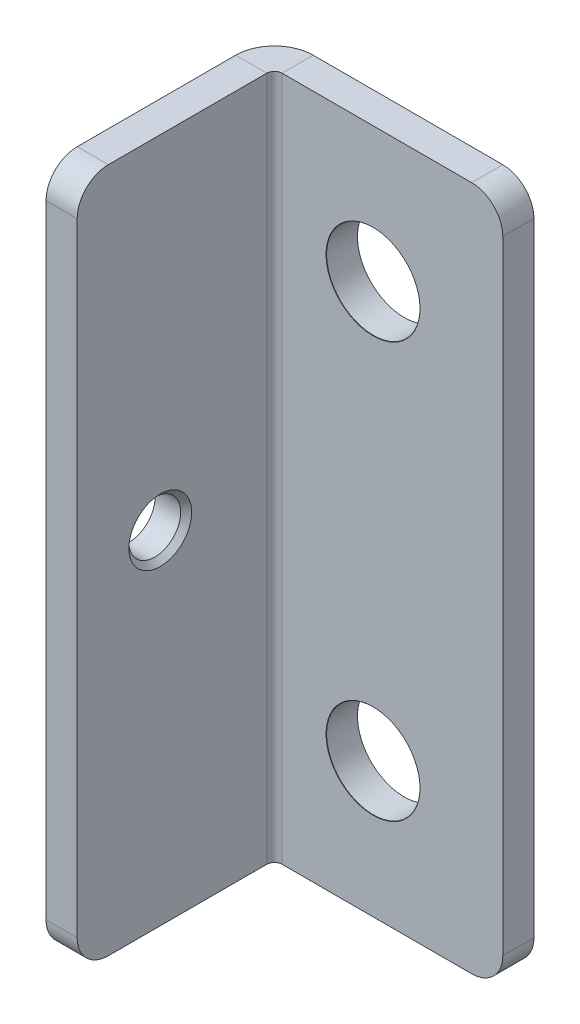
ISO-10303-21;
HEADER;
FILE_DESCRIPTION(('STEP AP214'),'2;1');
FILE_NAME('part.step','',(''),(''),'','','');
FILE_SCHEMA(('AUTOMOTIVE_DESIGN { 1 0 10303 214 1 1 1 1 }'));
ENDSEC;
DATA;
#1=APPLICATION_CONTEXT('core data for automotive mechanical design processes');
#2=APPLICATION_PROTOCOL_DEFINITION('international standard','automotive_design',2000,#1);
#3=PRODUCT_CONTEXT('',#1,'mechanical');
#4=PRODUCT('Part','Part','',(#3));
#5=PRODUCT_RELATED_PRODUCT_CATEGORY('part','',(#4));
#6=PRODUCT_DEFINITION_FORMATION('','',#4);
#7=PRODUCT_DEFINITION_CONTEXT('part definition',#1,'design');
#8=PRODUCT_DEFINITION('design','',#6,#7);
#9=PRODUCT_DEFINITION_SHAPE('','',#8);
#10=(LENGTH_UNIT() NAMED_UNIT(*) SI_UNIT(.MILLI.,.METRE.));
#11=(NAMED_UNIT(*) PLANE_ANGLE_UNIT() SI_UNIT($,.RADIAN.));
#12=(NAMED_UNIT(*) SI_UNIT($,.STERADIAN.) SOLID_ANGLE_UNIT());
#13=UNCERTAINTY_MEASURE_WITH_UNIT(LENGTH_MEASURE(1.E-05),#10,'distance_accuracy_value','');
#14=(GEOMETRIC_REPRESENTATION_CONTEXT(3) GLOBAL_UNCERTAINTY_ASSIGNED_CONTEXT((#13)) GLOBAL_UNIT_ASSIGNED_CONTEXT((#10,
#11,#12)) REPRESENTATION_CONTEXT('',''));
#15=CARTESIAN_POINT('',(0.,0.,0.));
#16=DIRECTION('',(0.,0.,1.));
#17=DIRECTION('',(1.,0.,0.));
#18=AXIS2_PLACEMENT_3D('',#15,#16,#17);
#19=CARTESIAN_POINT('',(-12.5,-33.,-3.));
#20=DIRECTION('',(0.,-1.,0.));
#21=DIRECTION('',(0.,0.,-1.));
#22=AXIS2_PLACEMENT_3D('',#19,#20,#21);
#23=PLANE('',#22);
#24=DIRECTION('',(1.,0.,0.));
#25=VECTOR('',#24,1.);
#26=CARTESIAN_POINT('',(-12.5,-33.,-3.));
#27=LINE('',#26,#25);
#28=CARTESIAN_POINT('',(-8.76339999999998,-33.,-3.));
#29=VERTEX_POINT('',#28);
#30=CARTESIAN_POINT('',(9.50000000000001,-33.,-3.));
#31=VERTEX_POINT('',#30);
#32=EDGE_CURVE('E258',#29,#31,#27,.T.);
#33=ORIENTED_EDGE('',*,*,#32,.T.);
#34=DIRECTION('',(0.,0.,1.));
#35=VECTOR('',#34,1.);
#36=CARTESIAN_POINT('',(9.50000000000001,-33.,-3.));
#37=LINE('',#36,#35);
#38=CARTESIAN_POINT('',(9.50000000000001,-33.,0.));
#39=VERTEX_POINT('',#38);
#40=EDGE_CURVE('E294',#31,#39,#37,.T.);
#41=ORIENTED_EDGE('',*,*,#40,.T.);
#42=DIRECTION('',(1.,0.,0.));
#43=VECTOR('',#42,1.);
#44=CARTESIAN_POINT('',(-12.5,-33.,0.));
#45=LINE('',#44,#43);
#46=CARTESIAN_POINT('',(-8.7634,-33.,0.));
#47=VERTEX_POINT('',#46);
#48=EDGE_CURVE('E251',#47,#39,#45,.T.);
#49=ORIENTED_EDGE('',*,*,#48,.F.);
#50=DIRECTION('',(0.,0.,-1.));
#51=VECTOR('',#50,1.);
#52=CARTESIAN_POINT('',(-8.7634,-33.,0.));
#53=LINE('',#52,#51);
#54=EDGE_CURVE('E227',#47,#29,#53,.T.);
#55=ORIENTED_EDGE('',*,*,#54,.T.);
#56=EDGE_LOOP('',(#33,#41,#49,#55));
#57=FACE_BOUND('',#56,.T.);
#58=ADVANCED_FACE('F68',(#57),#23,.T.);
#59=CARTESIAN_POINT('',(0.,0.,-3.));
#60=DIRECTION('',(0.,0.,1.));
#61=DIRECTION('',(1.,0.,0.));
#62=AXIS2_PLACEMENT_3D('',#59,#60,#61);
#63=PLANE('',#62);
#64=CARTESIAN_POINT('',(0.,20.,-3.));
#65=DIRECTION('',(0.,0.,1.));
#66=DIRECTION('',(1.,0.,0.));
#67=AXIS2_PLACEMENT_3D('',#64,#65,#66);
#68=CIRCLE('',#67,4.49999999999999);
#69=CARTESIAN_POINT('',(4.49999999999999,20.,-3.));
#70=VERTEX_POINT('',#69);
#71=EDGE_CURVE('E318',#70,#70,#68,.T.);
#72=ORIENTED_EDGE('',*,*,#71,.T.);
#73=EDGE_LOOP('',(#72));
#74=FACE_BOUND('',#73,.T.);
#75=CARTESIAN_POINT('',(0.,-20.,-3.));
#76=DIRECTION('',(0.,0.,1.));
#77=DIRECTION('',(1.,0.,0.));
#78=AXIS2_PLACEMENT_3D('',#75,#76,#77);
#79=CIRCLE('',#78,4.49999999999999);
#80=CARTESIAN_POINT('',(4.49999999999999,-20.,-3.));
#81=VERTEX_POINT('',#80);
#82=EDGE_CURVE('E223',#81,#81,#79,.T.);
#83=ORIENTED_EDGE('',*,*,#82,.T.);
#84=EDGE_LOOP('',(#83));
#85=FACE_BOUND('',#84,.T.);
#86=DIRECTION('',(0.,1.,0.));
#87=VECTOR('',#86,1.);
#88=CARTESIAN_POINT('',(12.5,33.,-3.));
#89=LINE('',#88,#87);
#90=CARTESIAN_POINT('',(12.5,-30.,-3.));
#91=VERTEX_POINT('',#90);
#92=CARTESIAN_POINT('',(12.5,30.,-3.));
#93=VERTEX_POINT('',#92);
#94=EDGE_CURVE('E249',#91,#93,#89,.T.);
#95=ORIENTED_EDGE('',*,*,#94,.F.);
#96=CARTESIAN_POINT('',(9.50000000000001,-30.,-3.));
#97=DIRECTION('',(0.,0.,1.));
#98=DIRECTION('',(1.,0.,0.));
#99=AXIS2_PLACEMENT_3D('',#96,#97,#98);
#100=CIRCLE('',#99,3.);
#101=EDGE_CURVE('E78',#91,#31,#100,.F.);
#102=ORIENTED_EDGE('',*,*,#101,.T.);
#103=ORIENTED_EDGE('',*,*,#32,.F.);
#104=DIRECTION('',(0.,-1.,0.));
#105=VECTOR('',#104,1.);
#106=CARTESIAN_POINT('',(-8.76339999999998,-33.,-3.));
#107=LINE('',#106,#105);
#108=CARTESIAN_POINT('',(-8.7634,33.,-3.));
#109=VERTEX_POINT('',#108);
#110=EDGE_CURVE('E168',#29,#109,#107,.F.);
#111=ORIENTED_EDGE('',*,*,#110,.T.);
#112=DIRECTION('',(-1.,0.,0.));
#113=VECTOR('',#112,1.);
#114=CARTESIAN_POINT('',(-12.5,33.,-3.));
#115=LINE('',#114,#113);
#116=CARTESIAN_POINT('',(9.5,33.,-3.));
#117=VERTEX_POINT('',#116);
#118=EDGE_CURVE('E252',#117,#109,#115,.T.);
#119=ORIENTED_EDGE('',*,*,#118,.F.);
#120=CARTESIAN_POINT('',(9.5,30.,-3.));
#121=DIRECTION('',(0.,0.,1.));
#122=DIRECTION('',(1.,0.,0.));
#123=AXIS2_PLACEMENT_3D('',#120,#121,#122);
#124=CIRCLE('',#123,3.);
#125=EDGE_CURVE('E95',#117,#93,#124,.F.);
#126=ORIENTED_EDGE('',*,*,#125,.T.);
#127=EDGE_LOOP('',(#95,#102,#103,#111,#119,#126));
#128=FACE_BOUND('',#127,.T.);
#129=ADVANCED_FACE('F356',(#74,#85,#128),#63,.F.);
#130=CARTESIAN_POINT('',(0.,0.,0.));
#131=DIRECTION('',(0.,0.,1.));
#132=DIRECTION('',(1.,0.,0.));
#133=AXIS2_PLACEMENT_3D('',#130,#131,#132);
#134=PLANE('',#133);
#135=CARTESIAN_POINT('',(0.,20.,0.));
#136=DIRECTION('',(0.,0.,1.));
#137=DIRECTION('',(1.,0.,0.));
#138=AXIS2_PLACEMENT_3D('',#135,#136,#137);
#139=CIRCLE('',#138,4.525);
#140=CARTESIAN_POINT('',(4.525,20.,0.));
#141=VERTEX_POINT('',#140);
#142=EDGE_CURVE('E329',#141,#141,#139,.T.);
#143=ORIENTED_EDGE('',*,*,#142,.F.);
#144=EDGE_LOOP('',(#143));
#145=FACE_BOUND('',#144,.T.);
#146=CARTESIAN_POINT('',(0.,-20.,0.));
#147=DIRECTION('',(0.,0.,1.));
#148=DIRECTION('',(1.,0.,0.));
#149=AXIS2_PLACEMENT_3D('',#146,#147,#148);
#150=CIRCLE('',#149,4.525);
#151=CARTESIAN_POINT('',(4.525,-20.,0.));
#152=VERTEX_POINT('',#151);
#153=EDGE_CURVE('E321',#152,#152,#150,.T.);
#154=ORIENTED_EDGE('',*,*,#153,.F.);
#155=EDGE_LOOP('',(#154));
#156=FACE_BOUND('',#155,.T.);
#157=ORIENTED_EDGE('',*,*,#48,.T.);
#158=CARTESIAN_POINT('',(9.50000000000001,-30.,0.));
#159=DIRECTION('',(0.,0.,1.));
#160=DIRECTION('',(1.,0.,0.));
#161=AXIS2_PLACEMENT_3D('',#158,#159,#160);
#162=CIRCLE('',#161,3.);
#163=CARTESIAN_POINT('',(12.5,-30.,0.));
#164=VERTEX_POINT('',#163);
#165=EDGE_CURVE('E303',#39,#164,#162,.T.);
#166=ORIENTED_EDGE('',*,*,#165,.T.);
#167=DIRECTION('',(0.,1.,0.));
#168=VECTOR('',#167,1.);
#169=CARTESIAN_POINT('',(12.5,33.,0.));
#170=LINE('',#169,#168);
#171=CARTESIAN_POINT('',(12.5,30.,0.));
#172=VERTEX_POINT('',#171);
#173=EDGE_CURVE('E245',#164,#172,#170,.T.);
#174=ORIENTED_EDGE('',*,*,#173,.T.);
#175=CARTESIAN_POINT('',(9.5,30.,0.));
#176=DIRECTION('',(0.,0.,1.));
#177=DIRECTION('',(1.,0.,0.));
#178=AXIS2_PLACEMENT_3D('',#175,#176,#177);
#179=CIRCLE('',#178,3.);
#180=CARTESIAN_POINT('',(9.5,33.,0.));
#181=VERTEX_POINT('',#180);
#182=EDGE_CURVE('E299',#172,#181,#179,.T.);
#183=ORIENTED_EDGE('',*,*,#182,.T.);
#184=DIRECTION('',(-1.,0.,0.));
#185=VECTOR('',#184,1.);
#186=CARTESIAN_POINT('',(-12.5,33.,0.));
#187=LINE('',#186,#185);
#188=CARTESIAN_POINT('',(-8.7634,33.,0.));
#189=VERTEX_POINT('',#188);
#190=EDGE_CURVE('E262',#181,#189,#187,.T.);
#191=ORIENTED_EDGE('',*,*,#190,.T.);
#192=DIRECTION('',(0.,-1.,0.));
#193=VECTOR('',#192,1.);
#194=CARTESIAN_POINT('',(-8.7634,-33.,0.));
#195=LINE('',#194,#193);
#196=EDGE_CURVE('E235',#47,#189,#195,.F.);
#197=ORIENTED_EDGE('',*,*,#196,.F.);
#198=EDGE_LOOP('',(#157,#166,#174,#183,#191,#197));
#199=FACE_BOUND('',#198,.T.);
#200=ADVANCED_FACE('F353',(#145,#156,#199),#134,.T.);
#201=CARTESIAN_POINT('',(12.5,33.,-3.));
#202=DIRECTION('',(1.,0.,0.));
#203=DIRECTION('',(0.,1.,0.));
#204=AXIS2_PLACEMENT_3D('',#201,#202,#203);
#205=PLANE('',#204);
#206=ORIENTED_EDGE('',*,*,#173,.F.);
#207=DIRECTION('',(0.,0.,1.));
#208=VECTOR('',#207,1.);
#209=CARTESIAN_POINT('',(12.5,-30.,-3.));
#210=LINE('',#209,#208);
#211=EDGE_CURVE('E306',#164,#91,#210,.F.);
#212=ORIENTED_EDGE('',*,*,#211,.T.);
#213=ORIENTED_EDGE('',*,*,#94,.T.);
#214=DIRECTION('',(0.,0.,1.));
#215=VECTOR('',#214,1.);
#216=CARTESIAN_POINT('',(12.5,30.,-3.));
#217=LINE('',#216,#215);
#218=EDGE_CURVE('E304',#93,#172,#217,.T.);
#219=ORIENTED_EDGE('',*,*,#218,.T.);
#220=EDGE_LOOP('',(#206,#212,#213,#219));
#221=FACE_BOUND('',#220,.T.);
#222=ADVANCED_FACE('F360',(#221),#205,.T.);
#223=CARTESIAN_POINT('',(-12.5,33.,-3.));
#224=DIRECTION('',(0.,1.,0.));
#225=DIRECTION('',(0.,0.,1.));
#226=AXIS2_PLACEMENT_3D('',#223,#224,#225);
#227=PLANE('',#226);
#228=ORIENTED_EDGE('',*,*,#190,.F.);
#229=DIRECTION('',(0.,0.,1.));
#230=VECTOR('',#229,1.);
#231=CARTESIAN_POINT('',(9.5,33.,-3.));
#232=LINE('',#231,#230);
#233=EDGE_CURVE('E13',#181,#117,#232,.F.);
#234=ORIENTED_EDGE('',*,*,#233,.T.);
#235=ORIENTED_EDGE('',*,*,#118,.T.);
#236=DIRECTION('',(0.,0.,-1.));
#237=VECTOR('',#236,1.);
#238=CARTESIAN_POINT('',(-8.7634,33.,0.));
#239=LINE('',#238,#237);
#240=EDGE_CURVE('E241',#189,#109,#239,.T.);
#241=ORIENTED_EDGE('',*,*,#240,.F.);
#242=EDGE_LOOP('',(#228,#234,#235,#241));
#243=FACE_BOUND('',#242,.T.);
#244=ADVANCED_FACE('F388',(#243),#227,.T.);
#245=CARTESIAN_POINT('',(-8.7634,33.,0.7366));
#246=DIRECTION('',(0.,1.,0.));
#247=DIRECTION('',(0.,0.,1.));
#248=AXIS2_PLACEMENT_3D('',#245,#246,#247);
#249=PLANE('',#248);
#250=DIRECTION('',(1.,0.,0.));
#251=VECTOR('',#250,1.);
#252=CARTESIAN_POINT('',(-12.5,33.,0.736599999999986));
#253=LINE('',#252,#251);
#254=CARTESIAN_POINT('',(-9.50000000000001,33.,0.736599999999998));
#255=VERTEX_POINT('',#254);
#256=CARTESIAN_POINT('',(-12.5,33.,0.736599999999987));
#257=VERTEX_POINT('',#256);
#258=EDGE_CURVE('E222',#255,#257,#253,.F.);
#259=ORIENTED_EDGE('',*,*,#258,.F.);
#260=CARTESIAN_POINT('',(-8.7634,33.,0.7366));
#261=DIRECTION('',(0.,-1.,0.));
#262=DIRECTION('',(0.,0.,-1.));
#263=AXIS2_PLACEMENT_3D('',#260,#261,#262);
#264=CIRCLE('',#263,0.736600000000004);
#265=EDGE_CURVE('E174',#189,#255,#264,.F.);
#266=ORIENTED_EDGE('',*,*,#265,.F.);
#267=ORIENTED_EDGE('',*,*,#240,.T.);
#268=CARTESIAN_POINT('',(-8.7634,33.,0.7366));
#269=DIRECTION('',(0.,-1.,0.));
#270=DIRECTION('',(0.,0.,-1.));
#271=AXIS2_PLACEMENT_3D('',#268,#269,#270);
#272=CIRCLE('',#271,3.7366);
#273=EDGE_CURVE('E226',#109,#257,#272,.F.);
#274=ORIENTED_EDGE('',*,*,#273,.T.);
#275=EDGE_LOOP('',(#259,#266,#267,#274));
#276=FACE_BOUND('',#275,.T.);
#277=ADVANCED_FACE('F389',(#276),#249,.T.);
#278=CARTESIAN_POINT('',(-8.7634,-33.,0.7366));
#279=DIRECTION('',(0.,1.,0.));
#280=DIRECTION('',(0.,0.,1.));
#281=AXIS2_PLACEMENT_3D('',#278,#279,#280);
#282=PLANE('',#281);
#283=CARTESIAN_POINT('',(-8.7634,-33.,0.7366));
#284=DIRECTION('',(0.,-1.,0.));
#285=DIRECTION('',(0.,0.,-1.));
#286=AXIS2_PLACEMENT_3D('',#283,#284,#285);
#287=CIRCLE('',#286,0.736600000000004);
#288=CARTESIAN_POINT('',(-9.50000000000001,-33.,0.736599999999998));
#289=VERTEX_POINT('',#288);
#290=EDGE_CURVE('E182',#289,#47,#287,.T.);
#291=ORIENTED_EDGE('',*,*,#290,.F.);
#292=DIRECTION('',(1.,0.,0.));
#293=VECTOR('',#292,1.);
#294=CARTESIAN_POINT('',(-9.49999999999999,-33.,0.736599999999999));
#295=LINE('',#294,#293);
#296=CARTESIAN_POINT('',(-12.5,-33.,0.736599999999988));
#297=VERTEX_POINT('',#296);
#298=EDGE_CURVE('E179',#289,#297,#295,.F.);
#299=ORIENTED_EDGE('',*,*,#298,.T.);
#300=CARTESIAN_POINT('',(-8.7634,-33.,0.7366));
#301=DIRECTION('',(0.,-1.,0.));
#302=DIRECTION('',(0.,0.,-1.));
#303=AXIS2_PLACEMENT_3D('',#300,#301,#302);
#304=CIRCLE('',#303,3.7366);
#305=EDGE_CURVE('E165',#297,#29,#304,.T.);
#306=ORIENTED_EDGE('',*,*,#305,.T.);
#307=ORIENTED_EDGE('',*,*,#54,.F.);
#308=EDGE_LOOP('',(#291,#299,#306,#307));
#309=FACE_BOUND('',#308,.T.);
#310=ADVANCED_FACE('F178',(#309),#282,.F.);
#311=CARTESIAN_POINT('',(-8.7634,-33.,0.7366));
#312=DIRECTION('',(0.,-1.,0.));
#313=DIRECTION('',(-1.,0.,0.));
#314=AXIS2_PLACEMENT_3D('',#311,#312,#313);
#315=CYLINDRICAL_SURFACE('',#314,3.7366);
#316=ORIENTED_EDGE('',*,*,#110,.F.);
#317=ORIENTED_EDGE('',*,*,#305,.F.);
#318=DIRECTION('',(0.,-1.,0.));
#319=VECTOR('',#318,1.);
#320=CARTESIAN_POINT('',(-12.5,33.,0.736599999999986));
#321=LINE('',#320,#319);
#322=EDGE_CURVE('E170',#297,#257,#321,.F.);
#323=ORIENTED_EDGE('',*,*,#322,.T.);
#324=ORIENTED_EDGE('',*,*,#273,.F.);
#325=EDGE_LOOP('',(#316,#317,#323,#324));
#326=FACE_BOUND('',#325,.T.);
#327=ADVANCED_FACE('F163',(#326),#315,.T.);
#328=CARTESIAN_POINT('',(-8.7634,-33.,0.7366));
#329=DIRECTION('',(0.,-1.,0.));
#330=DIRECTION('',(-1.,0.,0.));
#331=AXIS2_PLACEMENT_3D('',#328,#329,#330);
#332=CYLINDRICAL_SURFACE('',#331,0.736600000000004);
#333=ORIENTED_EDGE('',*,*,#196,.T.);
#334=ORIENTED_EDGE('',*,*,#265,.T.);
#335=DIRECTION('',(0.,-1.,0.));
#336=VECTOR('',#335,1.);
#337=CARTESIAN_POINT('',(-9.5,33.,0.736599999999997));
#338=LINE('',#337,#336);
#339=EDGE_CURVE('E187',#255,#289,#338,.T.);
#340=ORIENTED_EDGE('',*,*,#339,.T.);
#341=ORIENTED_EDGE('',*,*,#290,.T.);
#342=EDGE_LOOP('',(#333,#334,#340,#341));
#343=FACE_BOUND('',#342,.T.);
#344=ADVANCED_FACE('F368',(#343),#332,.F.);
#345=CARTESIAN_POINT('',(-12.5000000000001,-33.,19.));
#346=DIRECTION('',(0.,1.,0.));
#347=DIRECTION('',(-1.,0.,0.));
#348=AXIS2_PLACEMENT_3D('',#345,#346,#347);
#349=PLANE('',#348);
#350=DIRECTION('',(0.,0.,-1.));
#351=VECTOR('',#350,1.);
#352=CARTESIAN_POINT('',(-9.50000000000006,-33.,19.));
#353=LINE('',#352,#351);
#354=CARTESIAN_POINT('',(-9.50000000000005,-33.,16.));
#355=VERTEX_POINT('',#354);
#356=EDGE_CURVE('E196',#289,#355,#353,.F.);
#357=ORIENTED_EDGE('',*,*,#356,.T.);
#358=DIRECTION('',(1.,0.,0.));
#359=VECTOR('',#358,1.);
#360=CARTESIAN_POINT('',(-12.5,-33.,16.));
#361=LINE('',#360,#359);
#362=CARTESIAN_POINT('',(-12.5,-33.,16.));
#363=VERTEX_POINT('',#362);
#364=EDGE_CURVE('E205',#355,#363,#361,.F.);
#365=ORIENTED_EDGE('',*,*,#364,.T.);
#366=DIRECTION('',(0.,0.,1.));
#367=VECTOR('',#366,1.);
#368=CARTESIAN_POINT('',(-12.5,-33.,0.));
#369=LINE('',#368,#367);
#370=EDGE_CURVE('E191',#297,#363,#369,.T.);
#371=ORIENTED_EDGE('',*,*,#370,.F.);
#372=ORIENTED_EDGE('',*,*,#298,.F.);
#373=EDGE_LOOP('',(#357,#365,#371,#372));
#374=FACE_BOUND('',#373,.T.);
#375=ADVANCED_FACE('F199',(#374),#349,.F.);
#376=CARTESIAN_POINT('',(-12.5,33.,0.));
#377=DIRECTION('',(0.,-1.,0.));
#378=DIRECTION('',(1.,0.,0.));
#379=AXIS2_PLACEMENT_3D('',#376,#377,#378);
#380=PLANE('',#379);
#381=DIRECTION('',(0.,0.,-1.));
#382=VECTOR('',#381,1.);
#383=CARTESIAN_POINT('',(-12.5,33.,0.));
#384=LINE('',#383,#382);
#385=CARTESIAN_POINT('',(-12.5000000000001,33.,16.));
#386=VERTEX_POINT('',#385);
#387=EDGE_CURVE('E198',#386,#257,#384,.T.);
#388=ORIENTED_EDGE('',*,*,#387,.F.);
#389=DIRECTION('',(1.,0.,0.));
#390=VECTOR('',#389,1.);
#391=CARTESIAN_POINT('',(-12.5000000000001,33.,16.));
#392=LINE('',#391,#390);
#393=CARTESIAN_POINT('',(-9.50000000000006,33.,16.));
#394=VERTEX_POINT('',#393);
#395=EDGE_CURVE('E257',#386,#394,#392,.T.);
#396=ORIENTED_EDGE('',*,*,#395,.T.);
#397=DIRECTION('',(0.,0.,1.));
#398=VECTOR('',#397,1.);
#399=CARTESIAN_POINT('',(-9.5,33.,0.));
#400=LINE('',#399,#398);
#401=EDGE_CURVE('E202',#394,#255,#400,.F.);
#402=ORIENTED_EDGE('',*,*,#401,.T.);
#403=ORIENTED_EDGE('',*,*,#258,.T.);
#404=EDGE_LOOP('',(#388,#396,#402,#403));
#405=FACE_BOUND('',#404,.T.);
#406=ADVANCED_FACE('F384',(#405),#380,.F.);
#407=CARTESIAN_POINT('',(-12.5,0.,0.));
#408=DIRECTION('',(1.,0.,0.));
#409=DIRECTION('',(0.,0.,-1.));
#410=AXIS2_PLACEMENT_3D('',#407,#408,#409);
#411=PLANE('',#410);
#412=CARTESIAN_POINT('',(-12.5,0.,11.));
#413=DIRECTION('',(1.,0.,0.));
#414=DIRECTION('',(0.,0.,-1.));
#415=AXIS2_PLACEMENT_3D('',#412,#413,#414);
#416=CIRCLE('',#415,2.5);
#417=CARTESIAN_POINT('',(-12.5,0.,8.5));
#418=VERTEX_POINT('',#417);
#419=EDGE_CURVE('E71',#418,#418,#416,.T.);
#420=ORIENTED_EDGE('',*,*,#419,.T.);
#421=EDGE_LOOP('',(#420));
#422=FACE_BOUND('',#421,.T.);
#423=DIRECTION('',(0.,1.,0.));
#424=VECTOR('',#423,1.);
#425=CARTESIAN_POINT('',(-12.5000000000001,0.,19.));
#426=LINE('',#425,#424);
#427=CARTESIAN_POINT('',(-12.5000000000001,-30.,19.));
#428=VERTEX_POINT('',#427);
#429=CARTESIAN_POINT('',(-12.5000000000001,30.,19.));
#430=VERTEX_POINT('',#429);
#431=EDGE_CURVE('E204',#428,#430,#426,.T.);
#432=ORIENTED_EDGE('',*,*,#431,.T.);
#433=CARTESIAN_POINT('',(-12.5000000000001,30.,16.));
#434=DIRECTION('',(1.,0.,0.));
#435=DIRECTION('',(0.,0.,-1.));
#436=AXIS2_PLACEMENT_3D('',#433,#434,#435);
#437=CIRCLE('',#436,3.);
#438=EDGE_CURVE('E288',#430,#386,#437,.F.);
#439=ORIENTED_EDGE('',*,*,#438,.T.);
#440=ORIENTED_EDGE('',*,*,#387,.T.);
#441=ORIENTED_EDGE('',*,*,#322,.F.);
#442=ORIENTED_EDGE('',*,*,#370,.T.);
#443=CARTESIAN_POINT('',(-12.5,-30.,16.));
#444=DIRECTION('',(1.,0.,0.));
#445=DIRECTION('',(0.,0.,-1.));
#446=AXIS2_PLACEMENT_3D('',#443,#444,#445);
#447=CIRCLE('',#446,3.);
#448=EDGE_CURVE('E286',#363,#428,#447,.F.);
#449=ORIENTED_EDGE('',*,*,#448,.T.);
#450=EDGE_LOOP('',(#432,#439,#440,#441,#442,#449));
#451=FACE_BOUND('',#450,.T.);
#452=ADVANCED_FACE('F195',(#422,#451),#411,.F.);
#453=CARTESIAN_POINT('',(-9.5,0.,0.));
#454=DIRECTION('',(1.,0.,0.));
#455=DIRECTION('',(0.,0.,-1.));
#456=AXIS2_PLACEMENT_3D('',#453,#454,#455);
#457=PLANE('',#456);
#458=CARTESIAN_POINT('',(-9.50000000000004,0.,11.));
#459=DIRECTION('',(1.,0.,0.));
#460=DIRECTION('',(0.,0.,-1.));
#461=AXIS2_PLACEMENT_3D('',#458,#459,#460);
#462=CIRCLE('',#461,3.025);
#463=CARTESIAN_POINT('',(-9.50000000000003,0.,7.97500000000001));
#464=VERTEX_POINT('',#463);
#465=EDGE_CURVE('E631',#464,#464,#462,.T.);
#466=ORIENTED_EDGE('',*,*,#465,.F.);
#467=EDGE_LOOP('',(#466));
#468=FACE_BOUND('',#467,.T.);
#469=ORIENTED_EDGE('',*,*,#401,.F.);
#470=CARTESIAN_POINT('',(-9.50000000000006,30.,16.));
#471=DIRECTION('',(1.,0.,0.));
#472=DIRECTION('',(0.,0.,-1.));
#473=AXIS2_PLACEMENT_3D('',#470,#471,#472);
#474=CIRCLE('',#473,3.);
#475=CARTESIAN_POINT('',(-9.50000000000007,30.,19.));
#476=VERTEX_POINT('',#475);
#477=EDGE_CURVE('E277',#394,#476,#474,.T.);
#478=ORIENTED_EDGE('',*,*,#477,.T.);
#479=DIRECTION('',(0.,-1.,0.));
#480=VECTOR('',#479,1.);
#481=CARTESIAN_POINT('',(-9.50000000000007,33.,19.));
#482=LINE('',#481,#480);
#483=CARTESIAN_POINT('',(-9.50000000000006,-30.,19.));
#484=VERTEX_POINT('',#483);
#485=EDGE_CURVE('E209',#484,#476,#482,.F.);
#486=ORIENTED_EDGE('',*,*,#485,.F.);
#487=CARTESIAN_POINT('',(-9.50000000000005,-30.,16.));
#488=DIRECTION('',(1.,0.,0.));
#489=DIRECTION('',(0.,0.,-1.));
#490=AXIS2_PLACEMENT_3D('',#487,#488,#489);
#491=CIRCLE('',#490,3.);
#492=EDGE_CURVE('E272',#484,#355,#491,.T.);
#493=ORIENTED_EDGE('',*,*,#492,.T.);
#494=ORIENTED_EDGE('',*,*,#356,.F.);
#495=ORIENTED_EDGE('',*,*,#339,.F.);
#496=EDGE_LOOP('',(#469,#478,#486,#493,#494,#495));
#497=FACE_BOUND('',#496,.T.);
#498=ADVANCED_FACE('F371',(#468,#497),#457,.T.);
#499=CARTESIAN_POINT('',(-12.5000000000001,33.,19.));
#500=DIRECTION('',(0.,0.,-1.));
#501=DIRECTION('',(-1.,0.,0.));
#502=AXIS2_PLACEMENT_3D('',#499,#500,#501);
#503=PLANE('',#502);
#504=ORIENTED_EDGE('',*,*,#485,.T.);
#505=DIRECTION('',(1.,0.,0.));
#506=VECTOR('',#505,1.);
#507=CARTESIAN_POINT('',(-12.5000000000001,30.,19.));
#508=LINE('',#507,#506);
#509=EDGE_CURVE('E281',#476,#430,#508,.F.);
#510=ORIENTED_EDGE('',*,*,#509,.T.);
#511=ORIENTED_EDGE('',*,*,#431,.F.);
#512=DIRECTION('',(1.,0.,0.));
#513=VECTOR('',#512,1.);
#514=CARTESIAN_POINT('',(-12.5000000000001,-30.,19.));
#515=LINE('',#514,#513);
#516=EDGE_CURVE('E276',#428,#484,#515,.T.);
#517=ORIENTED_EDGE('',*,*,#516,.T.);
#518=EDGE_LOOP('',(#504,#510,#511,#517));
#519=FACE_BOUND('',#518,.T.);
#520=ADVANCED_FACE('F377',(#519),#503,.F.);
#521=CARTESIAN_POINT('',(-12.5000000000001,30.,16.));
#522=DIRECTION('',(1.,0.,0.));
#523=DIRECTION('',(0.,0.,-1.));
#524=AXIS2_PLACEMENT_3D('',#521,#522,#523);
#525=CYLINDRICAL_SURFACE('',#524,3.);
#526=ORIENTED_EDGE('',*,*,#438,.F.);
#527=ORIENTED_EDGE('',*,*,#509,.F.);
#528=ORIENTED_EDGE('',*,*,#477,.F.);
#529=ORIENTED_EDGE('',*,*,#395,.F.);
#530=EDGE_LOOP('',(#526,#527,#528,#529));
#531=FACE_BOUND('',#530,.T.);
#532=ADVANCED_FACE('F385',(#531),#525,.T.);
#533=CARTESIAN_POINT('',(-12.5000000000001,-30.,16.));
#534=DIRECTION('',(1.,0.,0.));
#535=DIRECTION('',(0.,0.,-1.));
#536=AXIS2_PLACEMENT_3D('',#533,#534,#535);
#537=CYLINDRICAL_SURFACE('',#536,3.);
#538=ORIENTED_EDGE('',*,*,#448,.F.);
#539=ORIENTED_EDGE('',*,*,#364,.F.);
#540=ORIENTED_EDGE('',*,*,#492,.F.);
#541=ORIENTED_EDGE('',*,*,#516,.F.);
#542=EDGE_LOOP('',(#538,#539,#540,#541));
#543=FACE_BOUND('',#542,.T.);
#544=ADVANCED_FACE('F372',(#543),#537,.T.);
#545=CARTESIAN_POINT('',(9.50000000000001,-30.,-3.));
#546=DIRECTION('',(0.,0.,1.));
#547=DIRECTION('',(1.,0.,0.));
#548=AXIS2_PLACEMENT_3D('',#545,#546,#547);
#549=CYLINDRICAL_SURFACE('',#548,3.);
#550=ORIENTED_EDGE('',*,*,#101,.F.);
#551=ORIENTED_EDGE('',*,*,#211,.F.);
#552=ORIENTED_EDGE('',*,*,#165,.F.);
#553=ORIENTED_EDGE('',*,*,#40,.F.);
#554=EDGE_LOOP('',(#550,#551,#552,#553));
#555=FACE_BOUND('',#554,.T.);
#556=ADVANCED_FACE('F391',(#555),#549,.T.);
#557=CARTESIAN_POINT('',(9.5,30.,-3.));
#558=DIRECTION('',(0.,0.,1.));
#559=DIRECTION('',(1.,0.,0.));
#560=AXIS2_PLACEMENT_3D('',#557,#558,#559);
#561=CYLINDRICAL_SURFACE('',#560,3.);
#562=ORIENTED_EDGE('',*,*,#125,.F.);
#563=ORIENTED_EDGE('',*,*,#233,.F.);
#564=ORIENTED_EDGE('',*,*,#182,.F.);
#565=ORIENTED_EDGE('',*,*,#218,.F.);
#566=EDGE_LOOP('',(#562,#563,#564,#565));
#567=FACE_BOUND('',#566,.T.);
#568=ADVANCED_FACE('F72',(#567),#561,.T.);
#569=CARTESIAN_POINT('',(0.,-20.,0.));
#570=DIRECTION('',(0.,0.,1.));
#571=DIRECTION('',(1.,0.,0.));
#572=AXIS2_PLACEMENT_3D('',#569,#570,#571);
#573=CYLINDRICAL_SURFACE('',#572,4.49999999999999);
#574=CARTESIAN_POINT('',(0.,-20.,-0.0250000000000111));
#575=DIRECTION('',(0.,0.,1.));
#576=DIRECTION('',(1.,0.,0.));
#577=AXIS2_PLACEMENT_3D('',#574,#575,#576);
#578=CIRCLE('',#577,4.49999999999999);
#579=CARTESIAN_POINT('',(4.49999999999999,-20.,-0.0250000000000111));
#580=VERTEX_POINT('',#579);
#581=EDGE_CURVE('E320',#580,#580,#578,.T.);
#582=ORIENTED_EDGE('',*,*,#581,.T.);
#583=EDGE_LOOP('',(#582));
#584=FACE_BOUND('',#583,.T.);
#585=ORIENTED_EDGE('',*,*,#82,.F.);
#586=EDGE_LOOP('',(#585));
#587=FACE_BOUND('',#586,.T.);
#588=ADVANCED_FACE('F343',(#584,#587),#573,.F.);
#589=CARTESIAN_POINT('',(0.,-20.,0.));
#590=DIRECTION('',(0.,0.,1.));
#591=DIRECTION('',(1.,0.,0.));
#592=AXIS2_PLACEMENT_3D('',#589,#590,#591);
#593=CONICAL_SURFACE('',#592,4.525,0.785398163397448);
#594=ORIENTED_EDGE('',*,*,#581,.F.);
#595=EDGE_LOOP('',(#594));
#596=FACE_BOUND('',#595,.T.);
#597=ORIENTED_EDGE('',*,*,#153,.T.);
#598=EDGE_LOOP('',(#597));
#599=FACE_BOUND('',#598,.T.);
#600=ADVANCED_FACE('F350',(#596,#599),#593,.F.);
#601=CARTESIAN_POINT('',(0.,20.,0.));
#602=DIRECTION('',(0.,0.,1.));
#603=DIRECTION('',(1.,0.,0.));
#604=AXIS2_PLACEMENT_3D('',#601,#602,#603);
#605=CYLINDRICAL_SURFACE('',#604,4.49999999999999);
#606=CARTESIAN_POINT('',(0.,20.,-0.0250000000000111));
#607=DIRECTION('',(0.,0.,1.));
#608=DIRECTION('',(1.,0.,0.));
#609=AXIS2_PLACEMENT_3D('',#606,#607,#608);
#610=CIRCLE('',#609,4.49999999999999);
#611=CARTESIAN_POINT('',(4.49999999999999,20.,-0.0250000000000111));
#612=VERTEX_POINT('',#611);
#613=EDGE_CURVE('E325',#612,#612,#610,.T.);
#614=ORIENTED_EDGE('',*,*,#613,.T.);
#615=EDGE_LOOP('',(#614));
#616=FACE_BOUND('',#615,.T.);
#617=ORIENTED_EDGE('',*,*,#71,.F.);
#618=EDGE_LOOP('',(#617));
#619=FACE_BOUND('',#618,.T.);
#620=ADVANCED_FACE('F348',(#616,#619),#605,.F.);
#621=CARTESIAN_POINT('',(0.,20.,0.));
#622=DIRECTION('',(0.,0.,1.));
#623=DIRECTION('',(1.,0.,0.));
#624=AXIS2_PLACEMENT_3D('',#621,#622,#623);
#625=CONICAL_SURFACE('',#624,4.525,0.785398163397448);
#626=ORIENTED_EDGE('',*,*,#613,.F.);
#627=EDGE_LOOP('',(#626));
#628=FACE_BOUND('',#627,.T.);
#629=ORIENTED_EDGE('',*,*,#142,.T.);
#630=EDGE_LOOP('',(#629));
#631=FACE_BOUND('',#630,.T.);
#632=ADVANCED_FACE('F460',(#628,#631),#625,.F.);
#633=CARTESIAN_POINT('',(-9.50000000000004,0.,11.));
#634=DIRECTION('',(1.,0.,0.));
#635=DIRECTION('',(0.,0.,-1.));
#636=AXIS2_PLACEMENT_3D('',#633,#634,#635);
#637=CYLINDRICAL_SURFACE('',#636,2.5);
#638=CARTESIAN_POINT('',(-10.025,0.,11.));
#639=DIRECTION('',(1.,0.,0.));
#640=DIRECTION('',(0.,0.,-1.));
#641=AXIS2_PLACEMENT_3D('',#638,#639,#640);
#642=CIRCLE('',#641,2.5);
#643=CARTESIAN_POINT('',(-10.025,0.,8.50000000000001));
#644=VERTEX_POINT('',#643);
#645=EDGE_CURVE('E632',#644,#644,#642,.T.);
#646=ORIENTED_EDGE('',*,*,#645,.T.);
#647=EDGE_LOOP('',(#646));
#648=FACE_BOUND('',#647,.T.);
#649=ORIENTED_EDGE('',*,*,#419,.F.);
#650=EDGE_LOOP('',(#649));
#651=FACE_BOUND('',#650,.T.);
#652=ADVANCED_FACE('F468',(#648,#651),#637,.F.);
#653=CARTESIAN_POINT('',(-9.50000000000004,0.,11.));
#654=DIRECTION('',(1.,0.,0.));
#655=DIRECTION('',(0.,0.,-1.));
#656=AXIS2_PLACEMENT_3D('',#653,#654,#655);
#657=CONICAL_SURFACE('',#656,3.025,0.785398163397449);
#658=ORIENTED_EDGE('',*,*,#645,.F.);
#659=EDGE_LOOP('',(#658));
#660=FACE_BOUND('',#659,.T.);
#661=ORIENTED_EDGE('',*,*,#465,.T.);
#662=EDGE_LOOP('',(#661));
#663=FACE_BOUND('',#662,.T.);
#664=ADVANCED_FACE('F476',(#660,#663),#657,.F.);
#665=CLOSED_SHELL('',(#58,#129,#200,#222,#244,#277,#310,#327,#344,#375,#406,#452,#498,#520,#532,
#544,#556,#568,#588,#600,#620,#632,#652,#664));
#666=MANIFOLD_SOLID_BREP('B2',#665);
#667=ADVANCED_BREP_SHAPE_REPRESENTATION('',(#18,#666),#14);
#668=SHAPE_DEFINITION_REPRESENTATION(#9,#667);
ENDSEC;
END-ISO-10303-21;
